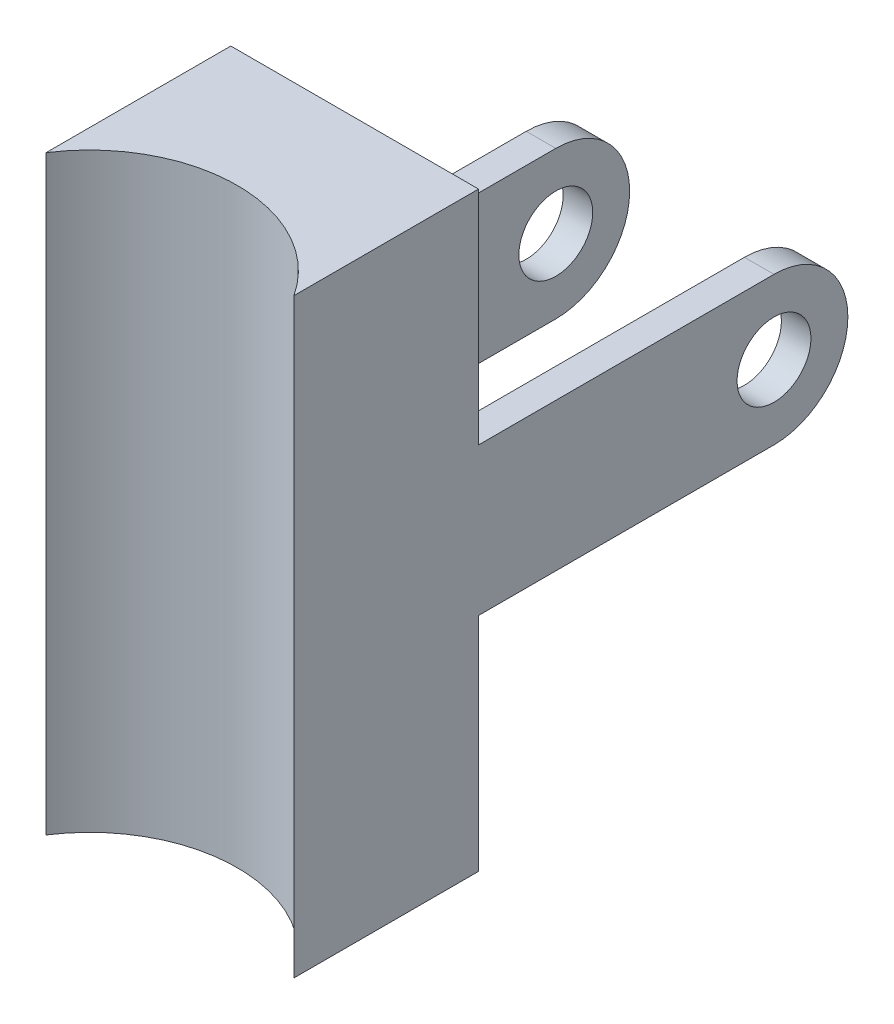
ISO-10303-21;
HEADER;
FILE_DESCRIPTION(('STEP AP214'),'2;1');
FILE_NAME('part.step','',(''),(''),'','','');
FILE_SCHEMA(('AUTOMOTIVE_DESIGN { 1 0 10303 214 1 1 1 1 }'));
ENDSEC;
DATA;
#1=APPLICATION_CONTEXT('core data for automotive mechanical design processes');
#2=APPLICATION_PROTOCOL_DEFINITION('international standard','automotive_design',2000,#1);
#3=PRODUCT_CONTEXT('',#1,'mechanical');
#4=PRODUCT('Part','Part','',(#3));
#5=PRODUCT_RELATED_PRODUCT_CATEGORY('part','',(#4));
#6=PRODUCT_DEFINITION_FORMATION('','',#4);
#7=PRODUCT_DEFINITION_CONTEXT('part definition',#1,'design');
#8=PRODUCT_DEFINITION('design','',#6,#7);
#9=PRODUCT_DEFINITION_SHAPE('','',#8);
#10=(LENGTH_UNIT() NAMED_UNIT(*) SI_UNIT(.MILLI.,.METRE.));
#11=(NAMED_UNIT(*) PLANE_ANGLE_UNIT() SI_UNIT($,.RADIAN.));
#12=(NAMED_UNIT(*) SI_UNIT($,.STERADIAN.) SOLID_ANGLE_UNIT());
#13=UNCERTAINTY_MEASURE_WITH_UNIT(LENGTH_MEASURE(1.E-05),#10,'distance_accuracy_value','');
#14=(GEOMETRIC_REPRESENTATION_CONTEXT(3) GLOBAL_UNCERTAINTY_ASSIGNED_CONTEXT((#13)) GLOBAL_UNIT_ASSIGNED_CONTEXT((#10,
#11,#12)) REPRESENTATION_CONTEXT('',''));
#15=CARTESIAN_POINT('',(0.,0.,0.));
#16=DIRECTION('',(0.,0.,1.));
#17=DIRECTION('',(1.,0.,0.));
#18=AXIS2_PLACEMENT_3D('',#15,#16,#17);
#19=CARTESIAN_POINT('',(-21.2985474856855,101.6,-45.5895041457416));
#20=DIRECTION('',(0.,0.,1.));
#21=DIRECTION('',(1.,0.,0.));
#22=AXIS2_PLACEMENT_3D('',#19,#20,#21);
#23=PLANE('',#22);
#24=DIRECTION('',(1.,0.,0.));
#25=VECTOR('',#24,1.);
#26=CARTESIAN_POINT('',(16.2185474856855,63.5,-45.5895041457416));
#27=LINE('',#26,#25);
#28=CARTESIAN_POINT('',(16.2185474856855,63.5,-45.5895041457416));
#29=VERTEX_POINT('',#28);
#30=CARTESIAN_POINT('',(21.2985474856855,63.5,-45.5895041457416));
#31=VERTEX_POINT('',#30);
#32=EDGE_CURVE('E63',#29,#31,#27,.T.);
#33=ORIENTED_EDGE('',*,*,#32,.F.);
#34=DIRECTION('',(0.,1.,0.));
#35=VECTOR('',#34,1.);
#36=CARTESIAN_POINT('',(16.2185474856855,63.5,-45.5895041457416));
#37=LINE('',#36,#35);
#38=CARTESIAN_POINT('',(16.2185474856855,38.1,-45.5895041457416));
#39=VERTEX_POINT('',#38);
#40=EDGE_CURVE('E68',#39,#29,#37,.T.);
#41=ORIENTED_EDGE('',*,*,#40,.F.);
#42=DIRECTION('',(1.,0.,0.));
#43=VECTOR('',#42,1.);
#44=CARTESIAN_POINT('',(16.2185474856855,38.1,-45.5895041457416));
#45=LINE('',#44,#43);
#46=CARTESIAN_POINT('',(21.2985474856855,38.1,-45.5895041457416));
#47=VERTEX_POINT('',#46);
#48=EDGE_CURVE('E158',#39,#47,#45,.T.);
#49=ORIENTED_EDGE('',*,*,#48,.T.);
#50=DIRECTION('',(0.,-1.,0.));
#51=VECTOR('',#50,1.);
#52=CARTESIAN_POINT('',(21.2985474856855,101.6,-45.5895041457416));
#53=LINE('',#52,#51);
#54=CARTESIAN_POINT('',(21.2985474856855,0.,-45.5895041457416));
#55=VERTEX_POINT('',#54);
#56=EDGE_CURVE('E266',#47,#55,#53,.T.);
#57=ORIENTED_EDGE('',*,*,#56,.T.);
#58=DIRECTION('',(-1.,0.,0.));
#59=VECTOR('',#58,1.);
#60=CARTESIAN_POINT('',(-21.2985474856855,0.,-45.5895041457416));
#61=LINE('',#60,#59);
#62=CARTESIAN_POINT('',(-21.2985474856855,0.,-45.5895041457416));
#63=VERTEX_POINT('',#62);
#64=EDGE_CURVE('E252',#55,#63,#61,.T.);
#65=ORIENTED_EDGE('',*,*,#64,.T.);
#66=DIRECTION('',(0.,-1.,0.));
#67=VECTOR('',#66,1.);
#68=CARTESIAN_POINT('',(-21.2985474856855,101.6,-45.5895041457416));
#69=LINE('',#68,#67);
#70=CARTESIAN_POINT('',(-21.2985474856855,38.1,-45.5895041457416));
#71=VERTEX_POINT('',#70);
#72=EDGE_CURVE('E261',#71,#63,#69,.T.);
#73=ORIENTED_EDGE('',*,*,#72,.F.);
#74=DIRECTION('',(-1.,0.,0.));
#75=VECTOR('',#74,1.);
#76=CARTESIAN_POINT('',(-16.2185474856855,38.1,-45.5895041457416));
#77=LINE('',#76,#75);
#78=CARTESIAN_POINT('',(-16.2185474856855,38.1,-45.5895041457416));
#79=VERTEX_POINT('',#78);
#80=EDGE_CURVE('E217',#79,#71,#77,.T.);
#81=ORIENTED_EDGE('',*,*,#80,.F.);
#82=DIRECTION('',(0.,1.,0.));
#83=VECTOR('',#82,1.);
#84=CARTESIAN_POINT('',(-16.2185474856855,63.5,-45.5895041457416));
#85=LINE('',#84,#83);
#86=CARTESIAN_POINT('',(-16.2185474856855,63.5,-45.5895041457416));
#87=VERTEX_POINT('',#86);
#88=EDGE_CURVE('E188',#79,#87,#85,.T.);
#89=ORIENTED_EDGE('',*,*,#88,.T.);
#90=DIRECTION('',(-1.,0.,0.));
#91=VECTOR('',#90,1.);
#92=CARTESIAN_POINT('',(-16.2185474856855,63.5,-45.5895041457416));
#93=LINE('',#92,#91);
#94=CARTESIAN_POINT('',(-21.2985474856855,63.5,-45.5895041457416));
#95=VERTEX_POINT('',#94);
#96=EDGE_CURVE('E205',#87,#95,#93,.T.);
#97=ORIENTED_EDGE('',*,*,#96,.T.);
#98=CARTESIAN_POINT('',(-21.2985474856855,101.6,-45.5895041457416));
#99=VERTEX_POINT('',#98);
#100=EDGE_CURVE('E262',#99,#95,#69,.T.);
#101=ORIENTED_EDGE('',*,*,#100,.F.);
#102=DIRECTION('',(-1.,0.,0.));
#103=VECTOR('',#102,1.);
#104=CARTESIAN_POINT('',(-21.2985474856855,101.6,-45.5895041457416));
#105=LINE('',#104,#103);
#106=CARTESIAN_POINT('',(21.2985474856855,101.6,-45.5895041457416));
#107=VERTEX_POINT('',#106);
#108=EDGE_CURVE('E238',#107,#99,#105,.T.);
#109=ORIENTED_EDGE('',*,*,#108,.F.);
#110=EDGE_CURVE('E55',#107,#31,#53,.T.);
#111=ORIENTED_EDGE('',*,*,#110,.T.);
#112=EDGE_LOOP('',(#33,#41,#49,#57,#65,#73,#81,#89,#97,#101,#109,#111));
#113=FACE_BOUND('',#112,.T.);
#114=ADVANCED_FACE('F45',(#113),#23,.F.);
#115=CARTESIAN_POINT('',(0.,101.6,0.));
#116=DIRECTION('',(0.,-1.,0.));
#117=DIRECTION('',(0.,0.,-1.));
#118=AXIS2_PLACEMENT_3D('',#115,#116,#117);
#119=CYLINDRICAL_SURFACE('',#118,25.4);
#120=CARTESIAN_POINT('',(0.,0.,0.));
#121=DIRECTION('',(0.,-1.,0.));
#122=DIRECTION('',(0.,0.,-1.));
#123=AXIS2_PLACEMENT_3D('',#120,#121,#122);
#124=CIRCLE('',#123,25.4);
#125=CARTESIAN_POINT('',(-21.2985474856855,0.,-13.8395041457416));
#126=VERTEX_POINT('',#125);
#127=CARTESIAN_POINT('',(21.2985474856855,0.,-13.8395041457416));
#128=VERTEX_POINT('',#127);
#129=EDGE_CURVE('E220',#126,#128,#124,.T.);
#130=ORIENTED_EDGE('',*,*,#129,.T.);
#131=DIRECTION('',(0.,-1.,0.));
#132=VECTOR('',#131,1.);
#133=CARTESIAN_POINT('',(21.2985474856855,101.6,-13.8395041457416));
#134=LINE('',#133,#132);
#135=CARTESIAN_POINT('',(21.2985474856855,101.6,-13.8395041457416));
#136=VERTEX_POINT('',#135);
#137=EDGE_CURVE('E11',#136,#128,#134,.T.);
#138=ORIENTED_EDGE('',*,*,#137,.F.);
#139=CARTESIAN_POINT('',(0.,101.6,0.));
#140=DIRECTION('',(0.,-1.,0.));
#141=DIRECTION('',(0.,0.,-1.));
#142=AXIS2_PLACEMENT_3D('',#139,#140,#141);
#143=CIRCLE('',#142,25.4);
#144=CARTESIAN_POINT('',(-21.2985474856855,101.6,-13.8395041457416));
#145=VERTEX_POINT('',#144);
#146=EDGE_CURVE('E230',#145,#136,#143,.T.);
#147=ORIENTED_EDGE('',*,*,#146,.F.);
#148=DIRECTION('',(0.,-1.,0.));
#149=VECTOR('',#148,1.);
#150=CARTESIAN_POINT('',(-21.2985474856855,101.6,-13.8395041457416));
#151=LINE('',#150,#149);
#152=EDGE_CURVE('E244',#145,#126,#151,.T.);
#153=ORIENTED_EDGE('',*,*,#152,.T.);
#154=EDGE_LOOP('',(#130,#138,#147,#153));
#155=FACE_BOUND('',#154,.T.);
#156=ADVANCED_FACE('F47',(#155),#119,.F.);
#157=CARTESIAN_POINT('',(21.2985474856855,101.6,-45.5895041457416));
#158=DIRECTION('',(-1.,0.,0.));
#159=DIRECTION('',(0.,0.,1.));
#160=AXIS2_PLACEMENT_3D('',#157,#158,#159);
#161=PLANE('',#160);
#162=CARTESIAN_POINT('',(21.2985474856855,50.8,-96.3895041457417));
#163=DIRECTION('',(-1.,0.,0.));
#164=DIRECTION('',(0.,0.,1.));
#165=AXIS2_PLACEMENT_3D('',#162,#163,#164);
#166=CIRCLE('',#165,6.35);
#167=CARTESIAN_POINT('',(21.2985474856855,50.8,-90.0395041457417));
#168=VERTEX_POINT('',#167);
#169=EDGE_CURVE('E309',#168,#168,#166,.T.);
#170=ORIENTED_EDGE('',*,*,#169,.T.);
#171=EDGE_LOOP('',(#170));
#172=FACE_BOUND('',#171,.T.);
#173=DIRECTION('',(0.,0.,-1.));
#174=VECTOR('',#173,1.);
#175=CARTESIAN_POINT('',(21.2985474856855,0.,-45.5895041457416));
#176=LINE('',#175,#174);
#177=EDGE_CURVE('E248',#128,#55,#176,.T.);
#178=ORIENTED_EDGE('',*,*,#177,.T.);
#179=ORIENTED_EDGE('',*,*,#56,.F.);
#180=DIRECTION('',(0.,0.,1.));
#181=VECTOR('',#180,1.);
#182=CARTESIAN_POINT('',(21.2985474856855,38.1,-45.5895041457416));
#183=LINE('',#182,#181);
#184=CARTESIAN_POINT('',(21.2985474856855,38.1,-96.3895041457417));
#185=VERTEX_POINT('',#184);
#186=EDGE_CURVE('E170',#185,#47,#183,.T.);
#187=ORIENTED_EDGE('',*,*,#186,.F.);
#188=CARTESIAN_POINT('',(21.2985474856855,50.8,-96.3895041457417));
#189=DIRECTION('',(-1.,0.,0.));
#190=DIRECTION('',(0.,0.,1.));
#191=AXIS2_PLACEMENT_3D('',#188,#189,#190);
#192=CIRCLE('',#191,12.7);
#193=CARTESIAN_POINT('',(21.2985474856855,63.5,-96.3895041457417));
#194=VERTEX_POINT('',#193);
#195=EDGE_CURVE('E152',#194,#185,#192,.T.);
#196=ORIENTED_EDGE('',*,*,#195,.F.);
#197=DIRECTION('',(0.,0.,-1.));
#198=VECTOR('',#197,1.);
#199=CARTESIAN_POINT('',(21.2985474856855,63.5,-45.5895041457416));
#200=LINE('',#199,#198);
#201=EDGE_CURVE('E164',#31,#194,#200,.T.);
#202=ORIENTED_EDGE('',*,*,#201,.F.);
#203=ORIENTED_EDGE('',*,*,#110,.F.);
#204=DIRECTION('',(0.,0.,-1.));
#205=VECTOR('',#204,1.);
#206=CARTESIAN_POINT('',(21.2985474856855,101.6,-45.5895041457416));
#207=LINE('',#206,#205);
#208=EDGE_CURVE('E234',#136,#107,#207,.T.);
#209=ORIENTED_EDGE('',*,*,#208,.F.);
#210=ORIENTED_EDGE('',*,*,#137,.T.);
#211=EDGE_LOOP('',(#178,#179,#187,#196,#202,#203,#209,#210));
#212=FACE_BOUND('',#211,.T.);
#213=ADVANCED_FACE('F295',(#172,#212),#161,.F.);
#214=CARTESIAN_POINT('',(-21.2985474856855,101.6,-13.8395041457416));
#215=DIRECTION('',(1.,0.,0.));
#216=DIRECTION('',(0.,0.,-1.));
#217=AXIS2_PLACEMENT_3D('',#214,#215,#216);
#218=PLANE('',#217);
#219=CARTESIAN_POINT('',(-21.2985474856855,50.8,-96.3895041457417));
#220=DIRECTION('',(-1.,0.,0.));
#221=DIRECTION('',(0.,0.,1.));
#222=AXIS2_PLACEMENT_3D('',#219,#220,#221);
#223=CIRCLE('',#222,6.35);
#224=CARTESIAN_POINT('',(-21.2985474856855,50.8,-90.0395041457417));
#225=VERTEX_POINT('',#224);
#226=EDGE_CURVE('E179',#225,#225,#223,.T.);
#227=ORIENTED_EDGE('',*,*,#226,.F.);
#228=EDGE_LOOP('',(#227));
#229=FACE_BOUND('',#228,.T.);
#230=DIRECTION('',(0.,0.,1.));
#231=VECTOR('',#230,1.);
#232=CARTESIAN_POINT('',(-21.2985474856855,0.,-13.8395041457416));
#233=LINE('',#232,#231);
#234=EDGE_CURVE('E235',#63,#126,#233,.T.);
#235=ORIENTED_EDGE('',*,*,#234,.T.);
#236=ORIENTED_EDGE('',*,*,#152,.F.);
#237=DIRECTION('',(0.,0.,1.));
#238=VECTOR('',#237,1.);
#239=CARTESIAN_POINT('',(-21.2985474856855,101.6,-13.8395041457416));
#240=LINE('',#239,#238);
#241=EDGE_CURVE('E241',#99,#145,#240,.T.);
#242=ORIENTED_EDGE('',*,*,#241,.F.);
#243=ORIENTED_EDGE('',*,*,#100,.T.);
#244=DIRECTION('',(0.,0.,-1.));
#245=VECTOR('',#244,1.);
#246=CARTESIAN_POINT('',(-21.2985474856855,63.5,-45.5895041457416));
#247=LINE('',#246,#245);
#248=CARTESIAN_POINT('',(-21.2985474856855,63.5,-96.3895041457417));
#249=VERTEX_POINT('',#248);
#250=EDGE_CURVE('E206',#95,#249,#247,.T.);
#251=ORIENTED_EDGE('',*,*,#250,.T.);
#252=CARTESIAN_POINT('',(-21.2985474856855,50.8,-96.3895041457417));
#253=DIRECTION('',(-1.,0.,0.));
#254=DIRECTION('',(0.,0.,1.));
#255=AXIS2_PLACEMENT_3D('',#252,#253,#254);
#256=CIRCLE('',#255,12.7);
#257=CARTESIAN_POINT('',(-21.2985474856855,38.1,-96.3895041457417));
#258=VERTEX_POINT('',#257);
#259=EDGE_CURVE('E210',#249,#258,#256,.T.);
#260=ORIENTED_EDGE('',*,*,#259,.T.);
#261=DIRECTION('',(0.,0.,1.));
#262=VECTOR('',#261,1.);
#263=CARTESIAN_POINT('',(-21.2985474856855,38.1,-45.5895041457416));
#264=LINE('',#263,#262);
#265=EDGE_CURVE('E193',#258,#71,#264,.T.);
#266=ORIENTED_EDGE('',*,*,#265,.T.);
#267=ORIENTED_EDGE('',*,*,#72,.T.);
#268=EDGE_LOOP('',(#235,#236,#242,#243,#251,#260,#266,#267));
#269=FACE_BOUND('',#268,.T.);
#270=ADVANCED_FACE('F298',(#229,#269),#218,.F.);
#271=CARTESIAN_POINT('',(0.,101.6,0.));
#272=DIRECTION('',(0.,-1.,0.));
#273=DIRECTION('',(0.,0.,-1.));
#274=AXIS2_PLACEMENT_3D('',#271,#272,#273);
#275=PLANE('',#274);
#276=ORIENTED_EDGE('',*,*,#146,.T.);
#277=ORIENTED_EDGE('',*,*,#208,.T.);
#278=ORIENTED_EDGE('',*,*,#108,.T.);
#279=ORIENTED_EDGE('',*,*,#241,.T.);
#280=EDGE_LOOP('',(#276,#277,#278,#279));
#281=FACE_BOUND('',#280,.T.);
#282=ADVANCED_FACE('F304',(#281),#275,.F.);
#283=CARTESIAN_POINT('',(0.,0.,0.));
#284=DIRECTION('',(0.,-1.,0.));
#285=DIRECTION('',(0.,0.,-1.));
#286=AXIS2_PLACEMENT_3D('',#283,#284,#285);
#287=PLANE('',#286);
#288=ORIENTED_EDGE('',*,*,#129,.F.);
#289=ORIENTED_EDGE('',*,*,#234,.F.);
#290=ORIENTED_EDGE('',*,*,#64,.F.);
#291=ORIENTED_EDGE('',*,*,#177,.F.);
#292=EDGE_LOOP('',(#288,#289,#290,#291));
#293=FACE_BOUND('',#292,.T.);
#294=ADVANCED_FACE('F315',(#293),#287,.T.);
#295=CARTESIAN_POINT('',(-16.2185474856855,38.1,-45.5895041457416));
#296=DIRECTION('',(0.,-1.,0.));
#297=DIRECTION('',(0.,0.,-1.));
#298=AXIS2_PLACEMENT_3D('',#295,#296,#297);
#299=PLANE('',#298);
#300=ORIENTED_EDGE('',*,*,#265,.F.);
#301=DIRECTION('',(-1.,0.,0.));
#302=VECTOR('',#301,1.);
#303=CARTESIAN_POINT('',(-16.2185474856855,38.1,-96.3895041457417));
#304=LINE('',#303,#302);
#305=CARTESIAN_POINT('',(-16.2185474856855,38.1,-96.3895041457417));
#306=VERTEX_POINT('',#305);
#307=EDGE_CURVE('E221',#306,#258,#304,.T.);
#308=ORIENTED_EDGE('',*,*,#307,.F.);
#309=DIRECTION('',(0.,0.,1.));
#310=VECTOR('',#309,1.);
#311=CARTESIAN_POINT('',(-16.2185474856855,38.1,-45.5895041457416));
#312=LINE('',#311,#310);
#313=EDGE_CURVE('E201',#306,#79,#312,.T.);
#314=ORIENTED_EDGE('',*,*,#313,.T.);
#315=ORIENTED_EDGE('',*,*,#80,.T.);
#316=EDGE_LOOP('',(#300,#308,#314,#315));
#317=FACE_BOUND('',#316,.T.);
#318=ADVANCED_FACE('F325',(#317),#299,.T.);
#319=CARTESIAN_POINT('',(-16.2185474856855,50.8,-96.3895041457417));
#320=DIRECTION('',(-1.,0.,0.));
#321=DIRECTION('',(0.,0.,1.));
#322=AXIS2_PLACEMENT_3D('',#319,#320,#321);
#323=CYLINDRICAL_SURFACE('',#322,12.7);
#324=ORIENTED_EDGE('',*,*,#259,.F.);
#325=DIRECTION('',(-1.,0.,0.));
#326=VECTOR('',#325,1.);
#327=CARTESIAN_POINT('',(-16.2185474856855,63.5,-96.3895041457417));
#328=LINE('',#327,#326);
#329=CARTESIAN_POINT('',(-16.2185474856855,63.5,-96.3895041457417));
#330=VERTEX_POINT('',#329);
#331=EDGE_CURVE('E224',#330,#249,#328,.T.);
#332=ORIENTED_EDGE('',*,*,#331,.F.);
#333=CARTESIAN_POINT('',(-16.2185474856855,50.8,-96.3895041457417));
#334=DIRECTION('',(-1.,0.,0.));
#335=DIRECTION('',(0.,0.,1.));
#336=AXIS2_PLACEMENT_3D('',#333,#334,#335);
#337=CIRCLE('',#336,12.7);
#338=EDGE_CURVE('E197',#330,#306,#337,.T.);
#339=ORIENTED_EDGE('',*,*,#338,.T.);
#340=ORIENTED_EDGE('',*,*,#307,.T.);
#341=EDGE_LOOP('',(#324,#332,#339,#340));
#342=FACE_BOUND('',#341,.T.);
#343=ADVANCED_FACE('F345',(#342),#323,.T.);
#344=CARTESIAN_POINT('',(-16.2185474856855,63.5,-45.5895041457416));
#345=DIRECTION('',(0.,1.,0.));
#346=DIRECTION('',(0.,0.,1.));
#347=AXIS2_PLACEMENT_3D('',#344,#345,#346);
#348=PLANE('',#347);
#349=ORIENTED_EDGE('',*,*,#250,.F.);
#350=ORIENTED_EDGE('',*,*,#96,.F.);
#351=DIRECTION('',(0.,0.,-1.));
#352=VECTOR('',#351,1.);
#353=CARTESIAN_POINT('',(-16.2185474856855,63.5,-45.5895041457416));
#354=LINE('',#353,#352);
#355=EDGE_CURVE('E192',#87,#330,#354,.T.);
#356=ORIENTED_EDGE('',*,*,#355,.T.);
#357=ORIENTED_EDGE('',*,*,#331,.T.);
#358=EDGE_LOOP('',(#349,#350,#356,#357));
#359=FACE_BOUND('',#358,.T.);
#360=ADVANCED_FACE('F287',(#359),#348,.T.);
#361=CARTESIAN_POINT('',(-16.2185474856855,50.8,-96.3895041457417));
#362=DIRECTION('',(-1.,0.,0.));
#363=DIRECTION('',(0.,0.,1.));
#364=AXIS2_PLACEMENT_3D('',#361,#362,#363);
#365=PLANE('',#364);
#366=CARTESIAN_POINT('',(-16.2185474856855,50.8,-96.3895041457417));
#367=DIRECTION('',(-1.,0.,0.));
#368=DIRECTION('',(0.,0.,1.));
#369=AXIS2_PLACEMENT_3D('',#366,#367,#368);
#370=CIRCLE('',#369,6.35);
#371=CARTESIAN_POINT('',(-16.2185474856855,50.8,-90.0395041457417));
#372=VERTEX_POINT('',#371);
#373=EDGE_CURVE('E187',#372,#372,#370,.T.);
#374=ORIENTED_EDGE('',*,*,#373,.T.);
#375=EDGE_LOOP('',(#374));
#376=FACE_BOUND('',#375,.T.);
#377=ORIENTED_EDGE('',*,*,#88,.F.);
#378=ORIENTED_EDGE('',*,*,#313,.F.);
#379=ORIENTED_EDGE('',*,*,#338,.F.);
#380=ORIENTED_EDGE('',*,*,#355,.F.);
#381=EDGE_LOOP('',(#377,#378,#379,#380));
#382=FACE_BOUND('',#381,.T.);
#383=ADVANCED_FACE('F272',(#376,#382),#365,.F.);
#384=CARTESIAN_POINT('',(21.2985474856855,50.8,-96.3895041457417));
#385=DIRECTION('',(-1.,0.,0.));
#386=DIRECTION('',(0.,0.,1.));
#387=AXIS2_PLACEMENT_3D('',#384,#385,#386);
#388=CYLINDRICAL_SURFACE('',#387,6.35);
#389=ORIENTED_EDGE('',*,*,#226,.T.);
#390=EDGE_LOOP('',(#389));
#391=FACE_BOUND('',#390,.T.);
#392=ORIENTED_EDGE('',*,*,#373,.F.);
#393=EDGE_LOOP('',(#392));
#394=FACE_BOUND('',#393,.T.);
#395=ADVANCED_FACE('F275',(#391,#394),#388,.F.);
#396=CARTESIAN_POINT('',(16.2185474856855,63.5,-45.5895041457416));
#397=DIRECTION('',(0.,-1.,0.));
#398=DIRECTION('',(0.,0.,-1.));
#399=AXIS2_PLACEMENT_3D('',#396,#397,#398);
#400=PLANE('',#399);
#401=ORIENTED_EDGE('',*,*,#201,.T.);
#402=DIRECTION('',(1.,0.,0.));
#403=VECTOR('',#402,1.);
#404=CARTESIAN_POINT('',(16.2185474856855,63.5,-96.3895041457417));
#405=LINE('',#404,#403);
#406=CARTESIAN_POINT('',(16.2185474856855,63.5,-96.3895041457417));
#407=VERTEX_POINT('',#406);
#408=EDGE_CURVE('E157',#407,#194,#405,.T.);
#409=ORIENTED_EDGE('',*,*,#408,.F.);
#410=DIRECTION('',(0.,0.,-1.));
#411=VECTOR('',#410,1.);
#412=CARTESIAN_POINT('',(16.2185474856855,63.5,-45.5895041457416));
#413=LINE('',#412,#411);
#414=EDGE_CURVE('E142',#29,#407,#413,.T.);
#415=ORIENTED_EDGE('',*,*,#414,.F.);
#416=ORIENTED_EDGE('',*,*,#32,.T.);
#417=EDGE_LOOP('',(#401,#409,#415,#416));
#418=FACE_BOUND('',#417,.T.);
#419=ADVANCED_FACE('F277',(#418),#400,.F.);
#420=CARTESIAN_POINT('',(16.2185474856855,50.8,-96.3895041457417));
#421=DIRECTION('',(1.,0.,0.));
#422=DIRECTION('',(0.,0.,-1.));
#423=AXIS2_PLACEMENT_3D('',#420,#421,#422);
#424=CYLINDRICAL_SURFACE('',#423,12.7);
#425=ORIENTED_EDGE('',*,*,#195,.T.);
#426=DIRECTION('',(1.,0.,0.));
#427=VECTOR('',#426,1.);
#428=CARTESIAN_POINT('',(16.2185474856855,38.1,-96.3895041457417));
#429=LINE('',#428,#427);
#430=CARTESIAN_POINT('',(16.2185474856855,38.1,-96.3895041457417));
#431=VERTEX_POINT('',#430);
#432=EDGE_CURVE('E149',#431,#185,#429,.T.);
#433=ORIENTED_EDGE('',*,*,#432,.F.);
#434=CARTESIAN_POINT('',(16.2185474856855,50.8,-96.3895041457417));
#435=DIRECTION('',(-1.,0.,0.));
#436=DIRECTION('',(0.,0.,1.));
#437=AXIS2_PLACEMENT_3D('',#434,#435,#436);
#438=CIRCLE('',#437,12.7);
#439=EDGE_CURVE('E136',#407,#431,#438,.T.);
#440=ORIENTED_EDGE('',*,*,#439,.F.);
#441=ORIENTED_EDGE('',*,*,#408,.T.);
#442=EDGE_LOOP('',(#425,#433,#440,#441));
#443=FACE_BOUND('',#442,.T.);
#444=ADVANCED_FACE('F150',(#443),#424,.T.);
#445=CARTESIAN_POINT('',(16.2185474856855,38.1,-45.5895041457416));
#446=DIRECTION('',(0.,1.,0.));
#447=DIRECTION('',(0.,0.,1.));
#448=AXIS2_PLACEMENT_3D('',#445,#446,#447);
#449=PLANE('',#448);
#450=ORIENTED_EDGE('',*,*,#186,.T.);
#451=ORIENTED_EDGE('',*,*,#48,.F.);
#452=DIRECTION('',(0.,0.,1.));
#453=VECTOR('',#452,1.);
#454=CARTESIAN_POINT('',(16.2185474856855,38.1,-45.5895041457416));
#455=LINE('',#454,#453);
#456=EDGE_CURVE('E140',#431,#39,#455,.T.);
#457=ORIENTED_EDGE('',*,*,#456,.F.);
#458=ORIENTED_EDGE('',*,*,#432,.T.);
#459=EDGE_LOOP('',(#450,#451,#457,#458));
#460=FACE_BOUND('',#459,.T.);
#461=ADVANCED_FACE('F160',(#460),#449,.F.);
#462=CARTESIAN_POINT('',(16.2185474856855,50.8,-96.3895041457417));
#463=DIRECTION('',(1.,0.,0.));
#464=DIRECTION('',(0.,0.,1.));
#465=AXIS2_PLACEMENT_3D('',#462,#463,#464);
#466=PLANE('',#465);
#467=CARTESIAN_POINT('',(16.2185474856855,50.8,-96.3895041457417));
#468=DIRECTION('',(1.,0.,0.));
#469=DIRECTION('',(0.,0.,-1.));
#470=AXIS2_PLACEMENT_3D('',#467,#468,#469);
#471=CIRCLE('',#470,6.35);
#472=CARTESIAN_POINT('',(16.2185474856855,50.8,-102.739504145742));
#473=VERTEX_POINT('',#472);
#474=EDGE_CURVE('E49',#473,#473,#471,.F.);
#475=ORIENTED_EDGE('',*,*,#474,.F.);
#476=EDGE_LOOP('',(#475));
#477=FACE_BOUND('',#476,.T.);
#478=ORIENTED_EDGE('',*,*,#40,.T.);
#479=ORIENTED_EDGE('',*,*,#414,.T.);
#480=ORIENTED_EDGE('',*,*,#439,.T.);
#481=ORIENTED_EDGE('',*,*,#456,.T.);
#482=EDGE_LOOP('',(#478,#479,#480,#481));
#483=FACE_BOUND('',#482,.T.);
#484=ADVANCED_FACE('F138',(#477,#483),#466,.F.);
#485=CARTESIAN_POINT('',(-21.2985474856855,50.8,-96.3895041457417));
#486=DIRECTION('',(1.,0.,0.));
#487=DIRECTION('',(0.,0.,-1.));
#488=AXIS2_PLACEMENT_3D('',#485,#486,#487);
#489=CYLINDRICAL_SURFACE('',#488,6.35);
#490=ORIENTED_EDGE('',*,*,#169,.F.);
#491=EDGE_LOOP('',(#490));
#492=FACE_BOUND('',#491,.T.);
#493=ORIENTED_EDGE('',*,*,#474,.T.);
#494=EDGE_LOOP('',(#493));
#495=FACE_BOUND('',#494,.T.);
#496=ADVANCED_FACE('F420',(#492,#495),#489,.F.);
#497=CLOSED_SHELL('',(#114,#156,#213,#270,#282,#294,#318,#343,#360,#383,#395,#419,#444,#461,
#484,#496));
#498=MANIFOLD_SOLID_BREP('B2',#497);
#499=ADVANCED_BREP_SHAPE_REPRESENTATION('',(#18,#498),#14);
#500=SHAPE_DEFINITION_REPRESENTATION(#9,#499);
ENDSEC;
END-ISO-10303-21;
